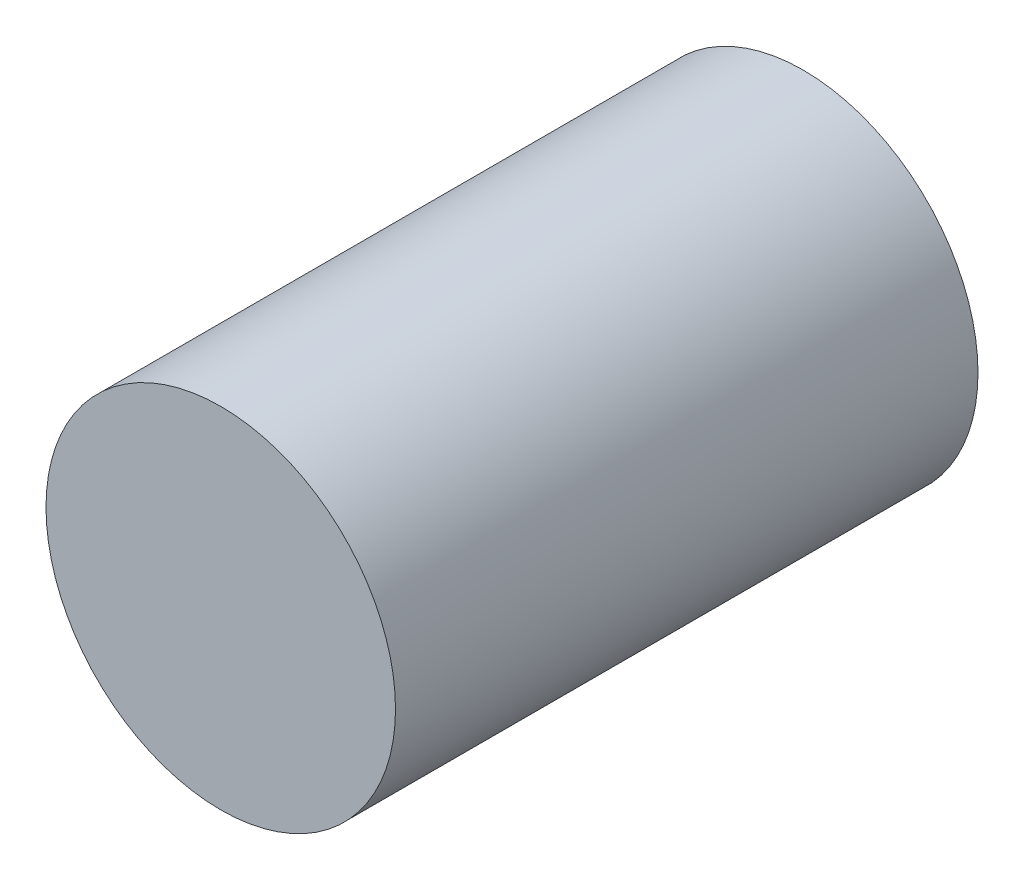
ISO-10303-21;
HEADER;
FILE_DESCRIPTION(('STEP AP214'),'2;1');
FILE_NAME('part.step','',(''),(''),'','','');
FILE_SCHEMA(('AUTOMOTIVE_DESIGN { 1 0 10303 214 1 1 1 1 }'));
ENDSEC;
DATA;
#1=APPLICATION_CONTEXT('core data for automotive mechanical design processes');
#2=APPLICATION_PROTOCOL_DEFINITION('international standard','automotive_design',2000,#1);
#3=PRODUCT_CONTEXT('',#1,'mechanical');
#4=PRODUCT('Part','Part','',(#3));
#5=PRODUCT_RELATED_PRODUCT_CATEGORY('part','',(#4));
#6=PRODUCT_DEFINITION_FORMATION('','',#4);
#7=PRODUCT_DEFINITION_CONTEXT('part definition',#1,'design');
#8=PRODUCT_DEFINITION('design','',#6,#7);
#9=PRODUCT_DEFINITION_SHAPE('','',#8);
#10=(LENGTH_UNIT() NAMED_UNIT(*) SI_UNIT(.MILLI.,.METRE.));
#11=(NAMED_UNIT(*) PLANE_ANGLE_UNIT() SI_UNIT($,.RADIAN.));
#12=(NAMED_UNIT(*) SI_UNIT($,.STERADIAN.) SOLID_ANGLE_UNIT());
#13=UNCERTAINTY_MEASURE_WITH_UNIT(LENGTH_MEASURE(1.E-05),#10,'distance_accuracy_value','');
#14=(GEOMETRIC_REPRESENTATION_CONTEXT(3) GLOBAL_UNCERTAINTY_ASSIGNED_CONTEXT((#13)) GLOBAL_UNIT_ASSIGNED_CONTEXT((#10,
#11,#12)) REPRESENTATION_CONTEXT('',''));
#15=CARTESIAN_POINT('',(0.,0.,0.));
#16=DIRECTION('',(0.,0.,1.));
#17=DIRECTION('',(1.,0.,0.));
#18=AXIS2_PLACEMENT_3D('',#15,#16,#17);
#19=CARTESIAN_POINT('',(0.,0.,3.));
#20=DIRECTION('',(0.,0.,-1.));
#21=DIRECTION('',(-1.,0.,0.));
#22=AXIS2_PLACEMENT_3D('',#19,#20,#21);
#23=CYLINDRICAL_SURFACE('',#22,0.75);
#24=CARTESIAN_POINT('',(0.,0.,3.));
#25=DIRECTION('',(0.,0.,1.));
#26=DIRECTION('',(1.,0.,0.));
#27=AXIS2_PLACEMENT_3D('',#24,#25,#26);
#28=CIRCLE('',#27,0.75);
#29=CARTESIAN_POINT('',(0.75,0.,3.));
#30=VERTEX_POINT('',#29);
#31=EDGE_CURVE('E10',#30,#30,#28,.T.);
#32=ORIENTED_EDGE('',*,*,#31,.F.);
#33=EDGE_LOOP('',(#32));
#34=FACE_BOUND('',#33,.T.);
#35=CARTESIAN_POINT('',(0.,0.,0.5));
#36=DIRECTION('',(0.,0.,-1.));
#37=DIRECTION('',(-1.,0.,0.));
#38=AXIS2_PLACEMENT_3D('',#35,#36,#37);
#39=CIRCLE('',#38,0.75);
#40=CARTESIAN_POINT('',(-0.75,0.,0.5));
#41=VERTEX_POINT('',#40);
#42=EDGE_CURVE('E41',#41,#41,#39,.T.);
#43=ORIENTED_EDGE('',*,*,#42,.F.);
#44=EDGE_LOOP('',(#43));
#45=FACE_BOUND('',#44,.T.);
#46=ADVANCED_FACE('F35',(#34,#45),#23,.T.);
#47=CARTESIAN_POINT('',(0.,0.,3.));
#48=DIRECTION('',(0.,0.,1.));
#49=DIRECTION('',(1.,0.,0.));
#50=AXIS2_PLACEMENT_3D('',#47,#48,#49);
#51=PLANE('',#50);
#52=ORIENTED_EDGE('',*,*,#31,.T.);
#53=EDGE_LOOP('',(#52));
#54=FACE_BOUND('',#53,.T.);
#55=ADVANCED_FACE('F50',(#54),#51,.T.);
#56=CARTESIAN_POINT('',(0.,0.,0.5));
#57=DIRECTION('',(0.,0.,-1.));
#58=DIRECTION('',(-1.,0.,0.));
#59=AXIS2_PLACEMENT_3D('',#56,#57,#58);
#60=PLANE('',#59);
#61=ORIENTED_EDGE('',*,*,#42,.T.);
#62=EDGE_LOOP('',(#61));
#63=FACE_BOUND('',#62,.T.);
#64=ADVANCED_FACE('F47',(#63),#60,.T.);
#65=CLOSED_SHELL('',(#46,#55,#64));
#66=MANIFOLD_SOLID_BREP('B2',#65);
#67=ADVANCED_BREP_SHAPE_REPRESENTATION('',(#18,#66),#14);
#68=SHAPE_DEFINITION_REPRESENTATION(#9,#67);
ENDSEC;
END-ISO-10303-21;
